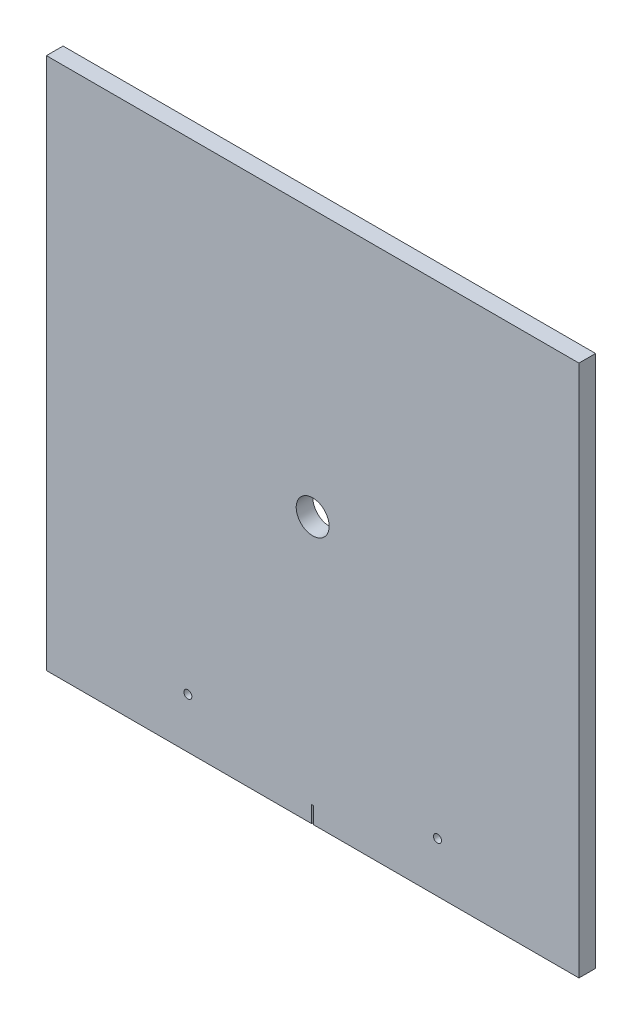
ISO-10303-21;
HEADER;
FILE_DESCRIPTION(('STEP AP214'),'2;1');
FILE_NAME('part.step','',(''),(''),'','','');
FILE_SCHEMA(('AUTOMOTIVE_DESIGN { 1 0 10303 214 1 1 1 1 }'));
ENDSEC;
DATA;
#1=APPLICATION_CONTEXT('core data for automotive mechanical design processes');
#2=APPLICATION_PROTOCOL_DEFINITION('international standard','automotive_design',2000,#1);
#3=PRODUCT_CONTEXT('',#1,'mechanical');
#4=PRODUCT('Part','Part','',(#3));
#5=PRODUCT_RELATED_PRODUCT_CATEGORY('part','',(#4));
#6=PRODUCT_DEFINITION_FORMATION('','',#4);
#7=PRODUCT_DEFINITION_CONTEXT('part definition',#1,'design');
#8=PRODUCT_DEFINITION('design','',#6,#7);
#9=PRODUCT_DEFINITION_SHAPE('','',#8);
#10=(LENGTH_UNIT() NAMED_UNIT(*) SI_UNIT(.MILLI.,.METRE.));
#11=(NAMED_UNIT(*) PLANE_ANGLE_UNIT() SI_UNIT($,.RADIAN.));
#12=(NAMED_UNIT(*) SI_UNIT($,.STERADIAN.) SOLID_ANGLE_UNIT());
#13=UNCERTAINTY_MEASURE_WITH_UNIT(LENGTH_MEASURE(1.E-05),#10,'distance_accuracy_value','');
#14=(GEOMETRIC_REPRESENTATION_CONTEXT(3) GLOBAL_UNCERTAINTY_ASSIGNED_CONTEXT((#13)) GLOBAL_UNIT_ASSIGNED_CONTEXT((#10,
#11,#12)) REPRESENTATION_CONTEXT('',''));
#15=CARTESIAN_POINT('',(0.,0.,0.));
#16=DIRECTION('',(0.,0.,1.));
#17=DIRECTION('',(1.,0.,0.));
#18=AXIS2_PLACEMENT_3D('',#15,#16,#17);
#19=CARTESIAN_POINT('',(-101.6,-101.6,6.35));
#20=DIRECTION('',(0.,1.,0.));
#21=DIRECTION('',(0.,0.,1.));
#22=AXIS2_PLACEMENT_3D('',#19,#20,#21);
#23=PLANE('',#22);
#24=DIRECTION('',(1.,0.,0.));
#25=VECTOR('',#24,1.);
#26=CARTESIAN_POINT('',(-101.6,-101.6,0.));
#27=LINE('',#26,#25);
#28=CARTESIAN_POINT('',(-101.6,-101.6,0.));
#29=VERTEX_POINT('',#28);
#30=CARTESIAN_POINT('',(-0.396875,-101.6,0.));
#31=VERTEX_POINT('',#30);
#32=EDGE_CURVE('E117',#29,#31,#27,.T.);
#33=ORIENTED_EDGE('',*,*,#32,.T.);
#34=DIRECTION('',(0.,0.,1.));
#35=VECTOR('',#34,1.);
#36=CARTESIAN_POINT('',(-0.396875,-101.6,0.));
#37=LINE('',#36,#35);
#38=CARTESIAN_POINT('',(-0.396875,-101.6,6.35));
#39=VERTEX_POINT('',#38);
#40=EDGE_CURVE('E105',#31,#39,#37,.T.);
#41=ORIENTED_EDGE('',*,*,#40,.T.);
#42=DIRECTION('',(1.,0.,0.));
#43=VECTOR('',#42,1.);
#44=CARTESIAN_POINT('',(-101.6,-101.6,6.35));
#45=LINE('',#44,#43);
#46=CARTESIAN_POINT('',(-101.6,-101.6,6.35));
#47=VERTEX_POINT('',#46);
#48=EDGE_CURVE('E83',#47,#39,#45,.T.);
#49=ORIENTED_EDGE('',*,*,#48,.F.);
#50=DIRECTION('',(0.,0.,-1.));
#51=VECTOR('',#50,1.);
#52=CARTESIAN_POINT('',(-101.6,-101.6,6.35));
#53=LINE('',#52,#51);
#54=EDGE_CURVE('E11',#47,#29,#53,.T.);
#55=ORIENTED_EDGE('',*,*,#54,.T.);
#56=EDGE_LOOP('',(#33,#41,#49,#55));
#57=FACE_BOUND('',#56,.T.);
#58=ADVANCED_FACE('F31',(#57),#23,.F.);
#59=CARTESIAN_POINT('',(-101.6,101.6,6.35));
#60=DIRECTION('',(1.,0.,0.));
#61=DIRECTION('',(0.,1.,0.));
#62=AXIS2_PLACEMENT_3D('',#59,#60,#61);
#63=PLANE('',#62);
#64=DIRECTION('',(0.,-1.,0.));
#65=VECTOR('',#64,1.);
#66=CARTESIAN_POINT('',(-101.6,101.6,0.));
#67=LINE('',#66,#65);
#68=CARTESIAN_POINT('',(-101.6,101.6,0.));
#69=VERTEX_POINT('',#68);
#70=EDGE_CURVE('E128',#69,#29,#67,.T.);
#71=ORIENTED_EDGE('',*,*,#70,.T.);
#72=ORIENTED_EDGE('',*,*,#54,.F.);
#73=DIRECTION('',(0.,-1.,0.));
#74=VECTOR('',#73,1.);
#75=CARTESIAN_POINT('',(-101.6,101.6,6.35));
#76=LINE('',#75,#74);
#77=CARTESIAN_POINT('',(-101.6,101.6,6.35));
#78=VERTEX_POINT('',#77);
#79=EDGE_CURVE('E133',#78,#47,#76,.T.);
#80=ORIENTED_EDGE('',*,*,#79,.F.);
#81=DIRECTION('',(0.,0.,-1.));
#82=VECTOR('',#81,1.);
#83=CARTESIAN_POINT('',(-101.6,101.6,6.35));
#84=LINE('',#83,#82);
#85=EDGE_CURVE('E134',#78,#69,#84,.T.);
#86=ORIENTED_EDGE('',*,*,#85,.T.);
#87=EDGE_LOOP('',(#71,#72,#80,#86));
#88=FACE_BOUND('',#87,.T.);
#89=ADVANCED_FACE('F33',(#88),#63,.F.);
#90=CARTESIAN_POINT('',(0.396875,-101.6,6.35));
#91=VERTEX_POINT('',#90);
#92=CARTESIAN_POINT('',(101.6,-101.6,6.35));
#93=VERTEX_POINT('',#92);
#94=EDGE_CURVE('E163',#91,#93,#45,.T.);
#95=ORIENTED_EDGE('',*,*,#94,.F.);
#96=DIRECTION('',(0.,0.,1.));
#97=VECTOR('',#96,1.);
#98=CARTESIAN_POINT('',(0.396875,-101.6,0.));
#99=LINE('',#98,#97);
#100=CARTESIAN_POINT('',(0.396875,-101.6,0.));
#101=VERTEX_POINT('',#100);
#102=EDGE_CURVE('E112',#101,#91,#99,.T.);
#103=ORIENTED_EDGE('',*,*,#102,.F.);
#104=CARTESIAN_POINT('',(101.6,-101.6,0.));
#105=VERTEX_POINT('',#104);
#106=EDGE_CURVE('E125',#101,#105,#27,.T.);
#107=ORIENTED_EDGE('',*,*,#106,.T.);
#108=DIRECTION('',(0.,0.,-1.));
#109=VECTOR('',#108,1.);
#110=CARTESIAN_POINT('',(101.6,-101.6,6.35));
#111=LINE('',#110,#109);
#112=EDGE_CURVE('E39',#93,#105,#111,.T.);
#113=ORIENTED_EDGE('',*,*,#112,.F.);
#114=EDGE_LOOP('',(#95,#103,#107,#113));
#115=FACE_BOUND('',#114,.T.);
#116=ADVANCED_FACE('F217',(#115),#23,.F.);
#117=CARTESIAN_POINT('',(101.6,101.6,6.35));
#118=DIRECTION('',(-1.,0.,0.));
#119=DIRECTION('',(0.,-1.,0.));
#120=AXIS2_PLACEMENT_3D('',#117,#118,#119);
#121=PLANE('',#120);
#122=DIRECTION('',(0.,1.,0.));
#123=VECTOR('',#122,1.);
#124=CARTESIAN_POINT('',(101.6,101.6,0.));
#125=LINE('',#124,#123);
#126=CARTESIAN_POINT('',(101.6,101.6,0.));
#127=VERTEX_POINT('',#126);
#128=EDGE_CURVE('E124',#105,#127,#125,.T.);
#129=ORIENTED_EDGE('',*,*,#128,.T.);
#130=DIRECTION('',(0.,0.,-1.));
#131=VECTOR('',#130,1.);
#132=CARTESIAN_POINT('',(101.6,101.6,6.35));
#133=LINE('',#132,#131);
#134=CARTESIAN_POINT('',(101.6,101.6,6.35));
#135=VERTEX_POINT('',#134);
#136=EDGE_CURVE('E136',#135,#127,#133,.T.);
#137=ORIENTED_EDGE('',*,*,#136,.F.);
#138=DIRECTION('',(0.,1.,0.));
#139=VECTOR('',#138,1.);
#140=CARTESIAN_POINT('',(101.6,101.6,6.35));
#141=LINE('',#140,#139);
#142=EDGE_CURVE('E144',#93,#135,#141,.T.);
#143=ORIENTED_EDGE('',*,*,#142,.F.);
#144=ORIENTED_EDGE('',*,*,#112,.T.);
#145=EDGE_LOOP('',(#129,#137,#143,#144));
#146=FACE_BOUND('',#145,.T.);
#147=ADVANCED_FACE('F142',(#146),#121,.F.);
#148=CARTESIAN_POINT('',(-101.6,101.6,6.35));
#149=DIRECTION('',(0.,-1.,0.));
#150=DIRECTION('',(0.,0.,-1.));
#151=AXIS2_PLACEMENT_3D('',#148,#149,#150);
#152=PLANE('',#151);
#153=DIRECTION('',(-1.,0.,0.));
#154=VECTOR('',#153,1.);
#155=CARTESIAN_POINT('',(-101.6,101.6,0.));
#156=LINE('',#155,#154);
#157=EDGE_CURVE('E76',#127,#69,#156,.T.);
#158=ORIENTED_EDGE('',*,*,#157,.T.);
#159=ORIENTED_EDGE('',*,*,#85,.F.);
#160=DIRECTION('',(-1.,0.,0.));
#161=VECTOR('',#160,1.);
#162=CARTESIAN_POINT('',(-101.6,101.6,6.35));
#163=LINE('',#162,#161);
#164=EDGE_CURVE('E55',#135,#78,#163,.T.);
#165=ORIENTED_EDGE('',*,*,#164,.F.);
#166=ORIENTED_EDGE('',*,*,#136,.T.);
#167=EDGE_LOOP('',(#158,#159,#165,#166));
#168=FACE_BOUND('',#167,.T.);
#169=ADVANCED_FACE('F168',(#168),#152,.F.);
#170=CARTESIAN_POINT('',(-101.6,-101.6,6.35));
#171=DIRECTION('',(0.,0.,1.));
#172=DIRECTION('',(1.,0.,0.));
#173=AXIS2_PLACEMENT_3D('',#170,#171,#172);
#174=PLANE('',#173);
#175=DIRECTION('',(0.,-1.,0.));
#176=VECTOR('',#175,1.);
#177=CARTESIAN_POINT('',(-0.396875,-95.25,6.35));
#178=LINE('',#177,#176);
#179=CARTESIAN_POINT('',(-0.396875,-95.25,6.35));
#180=VERTEX_POINT('',#179);
#181=EDGE_CURVE('E110',#180,#39,#178,.T.);
#182=ORIENTED_EDGE('',*,*,#181,.F.);
#183=DIRECTION('',(-1.,0.,0.));
#184=VECTOR('',#183,1.);
#185=CARTESIAN_POINT('',(-0.396875,-95.25,6.35));
#186=LINE('',#185,#184);
#187=CARTESIAN_POINT('',(0.396875,-95.25,6.35));
#188=VERTEX_POINT('',#187);
#189=EDGE_CURVE('E120',#188,#180,#186,.T.);
#190=ORIENTED_EDGE('',*,*,#189,.F.);
#191=DIRECTION('',(0.,1.,0.));
#192=VECTOR('',#191,1.);
#193=CARTESIAN_POINT('',(0.396875,-101.6,6.35));
#194=LINE('',#193,#192);
#195=EDGE_CURVE('E172',#91,#188,#194,.T.);
#196=ORIENTED_EDGE('',*,*,#195,.F.);
#197=ORIENTED_EDGE('',*,*,#94,.T.);
#198=ORIENTED_EDGE('',*,*,#142,.T.);
#199=ORIENTED_EDGE('',*,*,#164,.T.);
#200=ORIENTED_EDGE('',*,*,#79,.T.);
#201=ORIENTED_EDGE('',*,*,#48,.T.);
#202=EDGE_LOOP('',(#182,#190,#196,#197,#198,#199,#200,#201));
#203=FACE_BOUND('',#202,.T.);
#204=CARTESIAN_POINT('',(47.6250000000002,-82.4889197104677,6.35));
#205=DIRECTION('',(0.,0.,1.));
#206=DIRECTION('',(1.,0.,0.));
#207=AXIS2_PLACEMENT_3D('',#204,#205,#206);
#208=CIRCLE('',#207,1.52400000000002);
#209=CARTESIAN_POINT('',(49.1490000000002,-82.4889197104677,6.35));
#210=VERTEX_POINT('',#209);
#211=EDGE_CURVE('E182',#210,#210,#208,.T.);
#212=ORIENTED_EDGE('',*,*,#211,.F.);
#213=EDGE_LOOP('',(#212));
#214=FACE_BOUND('',#213,.T.);
#215=CARTESIAN_POINT('',(-47.625,-82.4889197104678,6.35));
#216=DIRECTION('',(0.,0.,1.));
#217=DIRECTION('',(1.,0.,0.));
#218=AXIS2_PLACEMENT_3D('',#215,#216,#217);
#219=CIRCLE('',#218,1.524);
#220=CARTESIAN_POINT('',(-46.101,-82.4889197104678,6.35));
#221=VERTEX_POINT('',#220);
#222=EDGE_CURVE('E159',#221,#221,#219,.T.);
#223=ORIENTED_EDGE('',*,*,#222,.F.);
#224=EDGE_LOOP('',(#223));
#225=FACE_BOUND('',#224,.T.);
#226=CARTESIAN_POINT('',(0.,0.,6.35));
#227=DIRECTION('',(0.,0.,1.));
#228=DIRECTION('',(1.,0.,0.));
#229=AXIS2_PLACEMENT_3D('',#226,#227,#228);
#230=CIRCLE('',#229,6.2865);
#231=CARTESIAN_POINT('',(6.2865,0.,6.35));
#232=VERTEX_POINT('',#231);
#233=EDGE_CURVE('E151',#232,#232,#230,.T.);
#234=ORIENTED_EDGE('',*,*,#233,.F.);
#235=EDGE_LOOP('',(#234));
#236=FACE_BOUND('',#235,.T.);
#237=ADVANCED_FACE('F165',(#203,#214,#225,#236),#174,.T.);
#238=CARTESIAN_POINT('',(-101.6,-101.6,0.));
#239=DIRECTION('',(0.,0.,1.));
#240=DIRECTION('',(1.,0.,0.));
#241=AXIS2_PLACEMENT_3D('',#238,#239,#240);
#242=PLANE('',#241);
#243=CARTESIAN_POINT('',(47.6250000000002,-82.4889197104677,0.));
#244=DIRECTION('',(0.,0.,1.));
#245=DIRECTION('',(1.,0.,0.));
#246=AXIS2_PLACEMENT_3D('',#243,#244,#245);
#247=CIRCLE('',#246,1.52400000000002);
#248=CARTESIAN_POINT('',(49.1490000000002,-82.4889197104677,0.));
#249=VERTEX_POINT('',#248);
#250=EDGE_CURVE('E186',#249,#249,#247,.T.);
#251=ORIENTED_EDGE('',*,*,#250,.T.);
#252=EDGE_LOOP('',(#251));
#253=FACE_BOUND('',#252,.T.);
#254=CARTESIAN_POINT('',(-47.625,-82.4889197104678,0.));
#255=DIRECTION('',(0.,0.,1.));
#256=DIRECTION('',(1.,0.,0.));
#257=AXIS2_PLACEMENT_3D('',#254,#255,#256);
#258=CIRCLE('',#257,1.524);
#259=CARTESIAN_POINT('',(-46.101,-82.4889197104678,0.));
#260=VERTEX_POINT('',#259);
#261=EDGE_CURVE('E156',#260,#260,#258,.T.);
#262=ORIENTED_EDGE('',*,*,#261,.T.);
#263=EDGE_LOOP('',(#262));
#264=FACE_BOUND('',#263,.T.);
#265=CARTESIAN_POINT('',(0.,0.,0.));
#266=DIRECTION('',(0.,0.,1.));
#267=DIRECTION('',(1.,0.,0.));
#268=AXIS2_PLACEMENT_3D('',#265,#266,#267);
#269=CIRCLE('',#268,6.2865);
#270=CARTESIAN_POINT('',(6.2865,0.,0.));
#271=VERTEX_POINT('',#270);
#272=EDGE_CURVE('E149',#271,#271,#269,.T.);
#273=ORIENTED_EDGE('',*,*,#272,.T.);
#274=EDGE_LOOP('',(#273));
#275=FACE_BOUND('',#274,.T.);
#276=DIRECTION('',(-1.,0.,0.));
#277=VECTOR('',#276,1.);
#278=CARTESIAN_POINT('',(-0.396875,-95.25,0.));
#279=LINE('',#278,#277);
#280=CARTESIAN_POINT('',(0.396875000000005,-95.25,0.));
#281=VERTEX_POINT('',#280);
#282=CARTESIAN_POINT('',(-0.396875,-95.25,0.));
#283=VERTEX_POINT('',#282);
#284=EDGE_CURVE('E46',#281,#283,#279,.T.);
#285=ORIENTED_EDGE('',*,*,#284,.T.);
#286=DIRECTION('',(0.,-1.,0.));
#287=VECTOR('',#286,1.);
#288=CARTESIAN_POINT('',(-0.396875,-95.25,0.));
#289=LINE('',#288,#287);
#290=EDGE_CURVE('E108',#283,#31,#289,.T.);
#291=ORIENTED_EDGE('',*,*,#290,.T.);
#292=ORIENTED_EDGE('',*,*,#32,.F.);
#293=ORIENTED_EDGE('',*,*,#70,.F.);
#294=ORIENTED_EDGE('',*,*,#157,.F.);
#295=ORIENTED_EDGE('',*,*,#128,.F.);
#296=ORIENTED_EDGE('',*,*,#106,.F.);
#297=DIRECTION('',(0.,1.,0.));
#298=VECTOR('',#297,1.);
#299=CARTESIAN_POINT('',(0.396875,-101.6,0.));
#300=LINE('',#299,#298);
#301=EDGE_CURVE('E119',#101,#281,#300,.T.);
#302=ORIENTED_EDGE('',*,*,#301,.T.);
#303=EDGE_LOOP('',(#285,#291,#292,#293,#294,#295,#296,#302));
#304=FACE_BOUND('',#303,.T.);
#305=ADVANCED_FACE('F115',(#253,#264,#275,#304),#242,.F.);
#306=CARTESIAN_POINT('',(0.,0.,0.));
#307=DIRECTION('',(0.,0.,1.));
#308=DIRECTION('',(1.,0.,0.));
#309=AXIS2_PLACEMENT_3D('',#306,#307,#308);
#310=CYLINDRICAL_SURFACE('',#309,6.2865);
#311=ORIENTED_EDGE('',*,*,#272,.F.);
#312=EDGE_LOOP('',(#311));
#313=FACE_BOUND('',#312,.T.);
#314=ORIENTED_EDGE('',*,*,#233,.T.);
#315=EDGE_LOOP('',(#314));
#316=FACE_BOUND('',#315,.T.);
#317=ADVANCED_FACE('F203',(#313,#316),#310,.F.);
#318=CARTESIAN_POINT('',(-47.625,-82.4889197104678,0.));
#319=DIRECTION('',(0.,0.,1.));
#320=DIRECTION('',(1.,0.,0.));
#321=AXIS2_PLACEMENT_3D('',#318,#319,#320);
#322=CYLINDRICAL_SURFACE('',#321,1.524);
#323=ORIENTED_EDGE('',*,*,#261,.F.);
#324=EDGE_LOOP('',(#323));
#325=FACE_BOUND('',#324,.T.);
#326=ORIENTED_EDGE('',*,*,#222,.T.);
#327=EDGE_LOOP('',(#326));
#328=FACE_BOUND('',#327,.T.);
#329=ADVANCED_FACE('F196',(#325,#328),#322,.F.);
#330=CARTESIAN_POINT('',(47.6250000000002,-82.4889197104677,0.));
#331=DIRECTION('',(0.,0.,1.));
#332=DIRECTION('',(1.,0.,0.));
#333=AXIS2_PLACEMENT_3D('',#330,#331,#332);
#334=CYLINDRICAL_SURFACE('',#333,1.52400000000002);
#335=ORIENTED_EDGE('',*,*,#250,.F.);
#336=EDGE_LOOP('',(#335));
#337=FACE_BOUND('',#336,.T.);
#338=ORIENTED_EDGE('',*,*,#211,.T.);
#339=EDGE_LOOP('',(#338));
#340=FACE_BOUND('',#339,.T.);
#341=ADVANCED_FACE('F211',(#337,#340),#334,.F.);
#342=CARTESIAN_POINT('',(-0.396875,-95.25,0.));
#343=DIRECTION('',(-1.,0.,0.));
#344=DIRECTION('',(0.,0.,1.));
#345=AXIS2_PLACEMENT_3D('',#342,#343,#344);
#346=PLANE('',#345);
#347=ORIENTED_EDGE('',*,*,#181,.T.);
#348=ORIENTED_EDGE('',*,*,#40,.F.);
#349=ORIENTED_EDGE('',*,*,#290,.F.);
#350=DIRECTION('',(0.,0.,1.));
#351=VECTOR('',#350,1.);
#352=CARTESIAN_POINT('',(-0.396875,-95.25,0.));
#353=LINE('',#352,#351);
#354=EDGE_CURVE('E180',#283,#180,#353,.T.);
#355=ORIENTED_EDGE('',*,*,#354,.T.);
#356=EDGE_LOOP('',(#347,#348,#349,#355));
#357=FACE_BOUND('',#356,.T.);
#358=ADVANCED_FACE('F107',(#357),#346,.F.);
#359=CARTESIAN_POINT('',(-0.396875,-95.25,0.));
#360=DIRECTION('',(0.,1.,0.));
#361=DIRECTION('',(0.,0.,1.));
#362=AXIS2_PLACEMENT_3D('',#359,#360,#361);
#363=PLANE('',#362);
#364=ORIENTED_EDGE('',*,*,#189,.T.);
#365=ORIENTED_EDGE('',*,*,#354,.F.);
#366=ORIENTED_EDGE('',*,*,#284,.F.);
#367=DIRECTION('',(0.,0.,1.));
#368=VECTOR('',#367,1.);
#369=CARTESIAN_POINT('',(0.396875,-95.25,0.));
#370=LINE('',#369,#368);
#371=EDGE_CURVE('E183',#281,#188,#370,.T.);
#372=ORIENTED_EDGE('',*,*,#371,.T.);
#373=EDGE_LOOP('',(#364,#365,#366,#372));
#374=FACE_BOUND('',#373,.T.);
#375=ADVANCED_FACE('F229',(#374),#363,.F.);
#376=CARTESIAN_POINT('',(0.396875,-101.6,0.));
#377=DIRECTION('',(1.,0.,0.));
#378=DIRECTION('',(0.,0.,-1.));
#379=AXIS2_PLACEMENT_3D('',#376,#377,#378);
#380=PLANE('',#379);
#381=ORIENTED_EDGE('',*,*,#195,.T.);
#382=ORIENTED_EDGE('',*,*,#371,.F.);
#383=ORIENTED_EDGE('',*,*,#301,.F.);
#384=ORIENTED_EDGE('',*,*,#102,.T.);
#385=EDGE_LOOP('',(#381,#382,#383,#384));
#386=FACE_BOUND('',#385,.T.);
#387=ADVANCED_FACE('F228',(#386),#380,.F.);
#388=CLOSED_SHELL('',(#58,#89,#116,#147,#169,#237,#305,#317,#329,#341,#358,#375,#387));
#389=MANIFOLD_SOLID_BREP('B2',#388);
#390=ADVANCED_BREP_SHAPE_REPRESENTATION('',(#18,#389),#14);
#391=SHAPE_DEFINITION_REPRESENTATION(#9,#390);
ENDSEC;
END-ISO-10303-21;
